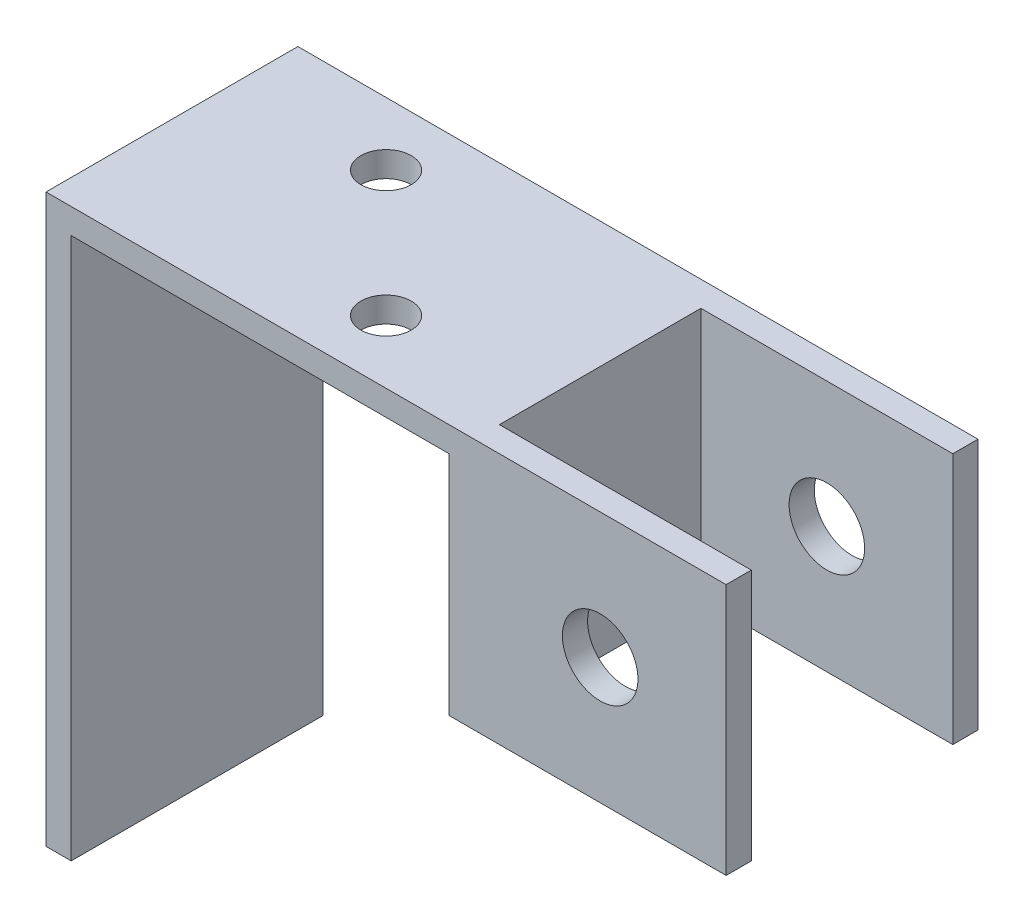
ISO-10303-21;
HEADER;
FILE_DESCRIPTION(('STEP AP214'),'2;1');
FILE_NAME('part.step','',(''),(''),'','','');
FILE_SCHEMA(('AUTOMOTIVE_DESIGN { 1 0 10303 214 1 1 1 1 }'));
ENDSEC;
DATA;
#1=APPLICATION_CONTEXT('core data for automotive mechanical design processes');
#2=APPLICATION_PROTOCOL_DEFINITION('international standard','automotive_design',2000,#1);
#3=PRODUCT_CONTEXT('',#1,'mechanical');
#4=PRODUCT('Part','Part','',(#3));
#5=PRODUCT_RELATED_PRODUCT_CATEGORY('part','',(#4));
#6=PRODUCT_DEFINITION_FORMATION('','',#4);
#7=PRODUCT_DEFINITION_CONTEXT('part definition',#1,'design');
#8=PRODUCT_DEFINITION('design','',#6,#7);
#9=PRODUCT_DEFINITION_SHAPE('','',#8);
#10=(LENGTH_UNIT() NAMED_UNIT(*) SI_UNIT(.MILLI.,.METRE.));
#11=(NAMED_UNIT(*) PLANE_ANGLE_UNIT() SI_UNIT($,.RADIAN.));
#12=(NAMED_UNIT(*) SI_UNIT($,.STERADIAN.) SOLID_ANGLE_UNIT());
#13=UNCERTAINTY_MEASURE_WITH_UNIT(LENGTH_MEASURE(1.E-05),#10,'distance_accuracy_value','');
#14=(GEOMETRIC_REPRESENTATION_CONTEXT(3) GLOBAL_UNCERTAINTY_ASSIGNED_CONTEXT((#13)) GLOBAL_UNIT_ASSIGNED_CONTEXT((#10,
#11,#12)) REPRESENTATION_CONTEXT('',''));
#15=CARTESIAN_POINT('',(0.,0.,0.));
#16=DIRECTION('',(0.,0.,1.));
#17=DIRECTION('',(1.,0.,0.));
#18=AXIS2_PLACEMENT_3D('',#15,#16,#17);
#19=CARTESIAN_POINT('',(25.7037037037037,-7.81481481481484,20.));
#20=DIRECTION('',(-1.,0.,0.));
#21=DIRECTION('',(0.,0.,1.));
#22=AXIS2_PLACEMENT_3D('',#19,#20,#21);
#23=PLANE('',#22);
#24=DIRECTION('',(0.,-1.,0.));
#25=VECTOR('',#24,1.);
#26=CARTESIAN_POINT('',(25.7037037037037,12.1851851851852,2.00000000000001));
#27=LINE('',#26,#25);
#28=CARTESIAN_POINT('',(25.7037037037037,12.1851851851852,2.00000000000001));
#29=VERTEX_POINT('',#28);
#30=CARTESIAN_POINT('',(25.7037037037037,-7.81481481481484,2.00000000000001));
#31=VERTEX_POINT('',#30);
#32=EDGE_CURVE('E51',#29,#31,#27,.T.);
#33=ORIENTED_EDGE('',*,*,#32,.F.);
#34=DIRECTION('',(0.,0.,-1.));
#35=VECTOR('',#34,1.);
#36=CARTESIAN_POINT('',(25.7037037037037,12.1851851851852,20.));
#37=LINE('',#36,#35);
#38=CARTESIAN_POINT('',(25.7037037037037,12.1851851851852,18.));
#39=VERTEX_POINT('',#38);
#40=EDGE_CURVE('E200',#39,#29,#37,.T.);
#41=ORIENTED_EDGE('',*,*,#40,.F.);
#42=DIRECTION('',(0.,1.,0.));
#43=VECTOR('',#42,1.);
#44=CARTESIAN_POINT('',(25.7037037037037,12.1851851851852,18.));
#45=LINE('',#44,#43);
#46=CARTESIAN_POINT('',(25.7037037037037,-7.81481481481484,18.));
#47=VERTEX_POINT('',#46);
#48=EDGE_CURVE('E159',#47,#39,#45,.T.);
#49=ORIENTED_EDGE('',*,*,#48,.F.);
#50=DIRECTION('',(0.,0.,-1.));
#51=VECTOR('',#50,1.);
#52=CARTESIAN_POINT('',(25.7037037037037,-7.81481481481484,20.));
#53=LINE('',#52,#51);
#54=EDGE_CURVE('E56',#47,#31,#53,.T.);
#55=ORIENTED_EDGE('',*,*,#54,.T.);
#56=EDGE_LOOP('',(#33,#41,#49,#55));
#57=FACE_BOUND('',#56,.T.);
#58=ADVANCED_FACE('F34',(#57),#23,.F.);
#59=CARTESIAN_POINT('',(25.7037037037037,12.1851851851852,20.));
#60=DIRECTION('',(0.,-1.,0.));
#61=DIRECTION('',(1.,0.,0.));
#62=AXIS2_PLACEMENT_3D('',#59,#60,#61);
#63=PLANE('',#62);
#64=CARTESIAN_POINT('',(13.7037037037037,12.1851851851852,15.));
#65=DIRECTION('',(0.,1.,0.));
#66=DIRECTION('',(-1.,0.,0.));
#67=AXIS2_PLACEMENT_3D('',#64,#65,#66);
#68=CIRCLE('',#67,2.);
#69=CARTESIAN_POINT('',(11.7037037037037,12.1851851851852,15.));
#70=VERTEX_POINT('',#69);
#71=EDGE_CURVE('E179',#70,#70,#68,.T.);
#72=ORIENTED_EDGE('',*,*,#71,.F.);
#73=EDGE_LOOP('',(#72));
#74=FACE_BOUND('',#73,.T.);
#75=CARTESIAN_POINT('',(3.70370370370367,12.1851851851852,5.));
#76=DIRECTION('',(0.,1.,0.));
#77=DIRECTION('',(-1.,0.,0.));
#78=AXIS2_PLACEMENT_3D('',#75,#76,#77);
#79=CIRCLE('',#78,2.);
#80=CARTESIAN_POINT('',(1.70370370370367,12.1851851851852,5.));
#81=VERTEX_POINT('',#80);
#82=EDGE_CURVE('E178',#81,#81,#79,.T.);
#83=ORIENTED_EDGE('',*,*,#82,.F.);
#84=EDGE_LOOP('',(#83));
#85=FACE_BOUND('',#84,.T.);
#86=DIRECTION('',(-1.,0.,0.));
#87=VECTOR('',#86,1.);
#88=CARTESIAN_POINT('',(25.7037037037037,12.1851851851852,0.));
#89=LINE('',#88,#87);
#90=CARTESIAN_POINT('',(45.7037037037037,12.1851851851852,0.));
#91=VERTEX_POINT('',#90);
#92=CARTESIAN_POINT('',(-8.29629629629633,12.1851851851852,0.));
#93=VERTEX_POINT('',#92);
#94=EDGE_CURVE('E123',#91,#93,#89,.T.);
#95=ORIENTED_EDGE('',*,*,#94,.T.);
#96=DIRECTION('',(0.,0.,-1.));
#97=VECTOR('',#96,1.);
#98=CARTESIAN_POINT('',(-8.29629629629633,12.1851851851852,20.));
#99=LINE('',#98,#97);
#100=CARTESIAN_POINT('',(-8.29629629629633,12.1851851851852,20.));
#101=VERTEX_POINT('',#100);
#102=EDGE_CURVE('E11',#101,#93,#99,.T.);
#103=ORIENTED_EDGE('',*,*,#102,.F.);
#104=DIRECTION('',(-1.,0.,0.));
#105=VECTOR('',#104,1.);
#106=CARTESIAN_POINT('',(25.7037037037037,12.1851851851852,20.));
#107=LINE('',#106,#105);
#108=CARTESIAN_POINT('',(45.7037037037037,12.1851851851852,20.));
#109=VERTEX_POINT('',#108);
#110=EDGE_CURVE('E185',#109,#101,#107,.T.);
#111=ORIENTED_EDGE('',*,*,#110,.F.);
#112=DIRECTION('',(0.,0.,1.));
#113=VECTOR('',#112,1.);
#114=CARTESIAN_POINT('',(45.7037037037037,12.1851851851852,20.));
#115=LINE('',#114,#113);
#116=CARTESIAN_POINT('',(45.7037037037037,12.1851851851852,18.));
#117=VERTEX_POINT('',#116);
#118=EDGE_CURVE('E167',#117,#109,#115,.T.);
#119=ORIENTED_EDGE('',*,*,#118,.F.);
#120=DIRECTION('',(-1.,0.,0.));
#121=VECTOR('',#120,1.);
#122=CARTESIAN_POINT('',(45.7037037037037,12.1851851851852,18.));
#123=LINE('',#122,#121);
#124=EDGE_CURVE('E170',#117,#39,#123,.T.);
#125=ORIENTED_EDGE('',*,*,#124,.T.);
#126=ORIENTED_EDGE('',*,*,#40,.T.);
#127=DIRECTION('',(-1.,0.,0.));
#128=VECTOR('',#127,1.);
#129=CARTESIAN_POINT('',(45.7037037037037,12.1851851851852,2.00000000000001));
#130=LINE('',#129,#128);
#131=CARTESIAN_POINT('',(45.7037037037037,12.1851851851852,2.00000000000001));
#132=VERTEX_POINT('',#131);
#133=EDGE_CURVE('E138',#132,#29,#130,.T.);
#134=ORIENTED_EDGE('',*,*,#133,.F.);
#135=DIRECTION('',(0.,0.,1.));
#136=VECTOR('',#135,1.);
#137=CARTESIAN_POINT('',(45.7037037037037,12.1851851851852,0.));
#138=LINE('',#137,#136);
#139=EDGE_CURVE('E136',#91,#132,#138,.T.);
#140=ORIENTED_EDGE('',*,*,#139,.F.);
#141=EDGE_LOOP('',(#95,#103,#111,#119,#125,#126,#134,#140));
#142=FACE_BOUND('',#141,.T.);
#143=ADVANCED_FACE('F36',(#74,#85,#142),#63,.F.);
#144=CARTESIAN_POINT('',(-8.29629629629633,12.1851851851852,20.));
#145=DIRECTION('',(1.,0.,0.));
#146=DIRECTION('',(0.,1.,0.));
#147=AXIS2_PLACEMENT_3D('',#144,#145,#146);
#148=PLANE('',#147);
#149=DIRECTION('',(0.,-1.,0.));
#150=VECTOR('',#149,1.);
#151=CARTESIAN_POINT('',(-8.29629629629633,12.1851851851852,0.));
#152=LINE('',#151,#150);
#153=CARTESIAN_POINT('',(-8.29629629629632,-32.8148148148148,0.));
#154=VERTEX_POINT('',#153);
#155=EDGE_CURVE('E130',#93,#154,#152,.T.);
#156=ORIENTED_EDGE('',*,*,#155,.T.);
#157=DIRECTION('',(0.,0.,-1.));
#158=VECTOR('',#157,1.);
#159=CARTESIAN_POINT('',(-8.29629629629632,-32.8148148148148,20.));
#160=LINE('',#159,#158);
#161=CARTESIAN_POINT('',(-8.29629629629632,-32.8148148148148,20.));
#162=VERTEX_POINT('',#161);
#163=EDGE_CURVE('E43',#162,#154,#160,.T.);
#164=ORIENTED_EDGE('',*,*,#163,.F.);
#165=DIRECTION('',(0.,-1.,0.));
#166=VECTOR('',#165,1.);
#167=CARTESIAN_POINT('',(-8.29629629629633,12.1851851851852,20.));
#168=LINE('',#167,#166);
#169=EDGE_CURVE('E188',#101,#162,#168,.T.);
#170=ORIENTED_EDGE('',*,*,#169,.F.);
#171=ORIENTED_EDGE('',*,*,#102,.T.);
#172=EDGE_LOOP('',(#156,#164,#170,#171));
#173=FACE_BOUND('',#172,.T.);
#174=ADVANCED_FACE('F255',(#173),#148,.F.);
#175=CARTESIAN_POINT('',(-8.29629629629632,-32.8148148148148,20.));
#176=DIRECTION('',(0.,1.,0.));
#177=DIRECTION('',(0.,0.,1.));
#178=AXIS2_PLACEMENT_3D('',#175,#176,#177);
#179=PLANE('',#178);
#180=DIRECTION('',(1.,0.,0.));
#181=VECTOR('',#180,1.);
#182=CARTESIAN_POINT('',(-8.29629629629632,-32.8148148148148,0.));
#183=LINE('',#182,#181);
#184=CARTESIAN_POINT('',(-6.29629629629632,-32.8148148148148,0.));
#185=VERTEX_POINT('',#184);
#186=EDGE_CURVE('E203',#154,#185,#183,.T.);
#187=ORIENTED_EDGE('',*,*,#186,.T.);
#188=DIRECTION('',(0.,0.,-1.));
#189=VECTOR('',#188,1.);
#190=CARTESIAN_POINT('',(-6.29629629629632,-32.8148148148148,20.));
#191=LINE('',#190,#189);
#192=CARTESIAN_POINT('',(-6.29629629629632,-32.8148148148148,20.));
#193=VERTEX_POINT('',#192);
#194=EDGE_CURVE('E223',#193,#185,#191,.T.);
#195=ORIENTED_EDGE('',*,*,#194,.F.);
#196=DIRECTION('',(1.,0.,0.));
#197=VECTOR('',#196,1.);
#198=CARTESIAN_POINT('',(-8.29629629629632,-32.8148148148148,20.));
#199=LINE('',#198,#197);
#200=EDGE_CURVE('E191',#162,#193,#199,.T.);
#201=ORIENTED_EDGE('',*,*,#200,.F.);
#202=ORIENTED_EDGE('',*,*,#163,.T.);
#203=EDGE_LOOP('',(#187,#195,#201,#202));
#204=FACE_BOUND('',#203,.T.);
#205=ADVANCED_FACE('F274',(#204),#179,.F.);
#206=CARTESIAN_POINT('',(-6.29629629629632,-32.8148148148148,20.));
#207=DIRECTION('',(-1.,0.,0.));
#208=DIRECTION('',(0.,-1.,0.));
#209=AXIS2_PLACEMENT_3D('',#206,#207,#208);
#210=PLANE('',#209);
#211=DIRECTION('',(0.,1.,0.));
#212=VECTOR('',#211,1.);
#213=CARTESIAN_POINT('',(-6.29629629629632,-32.8148148148148,0.));
#214=LINE('',#213,#212);
#215=CARTESIAN_POINT('',(-6.29629629629633,10.1851851851852,0.));
#216=VERTEX_POINT('',#215);
#217=EDGE_CURVE('E205',#185,#216,#214,.T.);
#218=ORIENTED_EDGE('',*,*,#217,.T.);
#219=DIRECTION('',(0.,0.,-1.));
#220=VECTOR('',#219,1.);
#221=CARTESIAN_POINT('',(-6.29629629629633,10.1851851851852,20.));
#222=LINE('',#221,#220);
#223=CARTESIAN_POINT('',(-6.29629629629633,10.1851851851852,20.));
#224=VERTEX_POINT('',#223);
#225=EDGE_CURVE('E220',#224,#216,#222,.T.);
#226=ORIENTED_EDGE('',*,*,#225,.F.);
#227=DIRECTION('',(0.,1.,0.));
#228=VECTOR('',#227,1.);
#229=CARTESIAN_POINT('',(-6.29629629629632,-32.8148148148148,20.));
#230=LINE('',#229,#228);
#231=EDGE_CURVE('E193',#193,#224,#230,.T.);
#232=ORIENTED_EDGE('',*,*,#231,.F.);
#233=ORIENTED_EDGE('',*,*,#194,.T.);
#234=EDGE_LOOP('',(#218,#226,#232,#233));
#235=FACE_BOUND('',#234,.T.);
#236=ADVANCED_FACE('F271',(#235),#210,.F.);
#237=CARTESIAN_POINT('',(-6.29629629629633,10.1851851851852,20.));
#238=DIRECTION('',(0.,1.,0.));
#239=DIRECTION('',(-1.,0.,0.));
#240=AXIS2_PLACEMENT_3D('',#237,#238,#239);
#241=PLANE('',#240);
#242=CARTESIAN_POINT('',(13.7037037037037,10.1851851851852,15.));
#243=DIRECTION('',(0.,1.,0.));
#244=DIRECTION('',(-1.,0.,0.));
#245=AXIS2_PLACEMENT_3D('',#242,#243,#244);
#246=CIRCLE('',#245,2.);
#247=CARTESIAN_POINT('',(11.7037037037037,10.1851851851852,15.));
#248=VERTEX_POINT('',#247);
#249=EDGE_CURVE('E133',#248,#248,#246,.T.);
#250=ORIENTED_EDGE('',*,*,#249,.T.);
#251=EDGE_LOOP('',(#250));
#252=FACE_BOUND('',#251,.T.);
#253=CARTESIAN_POINT('',(3.70370370370367,10.1851851851852,5.));
#254=DIRECTION('',(0.,1.,0.));
#255=DIRECTION('',(-1.,0.,0.));
#256=AXIS2_PLACEMENT_3D('',#253,#254,#255);
#257=CIRCLE('',#256,2.);
#258=CARTESIAN_POINT('',(1.70370370370367,10.1851851851852,5.));
#259=VERTEX_POINT('',#258);
#260=EDGE_CURVE('E182',#259,#259,#257,.T.);
#261=ORIENTED_EDGE('',*,*,#260,.T.);
#262=EDGE_LOOP('',(#261));
#263=FACE_BOUND('',#262,.T.);
#264=DIRECTION('',(1.,0.,0.));
#265=VECTOR('',#264,1.);
#266=CARTESIAN_POINT('',(-6.29629629629633,10.1851851851852,0.));
#267=LINE('',#266,#265);
#268=CARTESIAN_POINT('',(23.7037037037037,10.1851851851852,0.));
#269=VERTEX_POINT('',#268);
#270=EDGE_CURVE('E207',#216,#269,#267,.T.);
#271=ORIENTED_EDGE('',*,*,#270,.T.);
#272=DIRECTION('',(0.,0.,-1.));
#273=VECTOR('',#272,1.);
#274=CARTESIAN_POINT('',(23.7037037037037,10.1851851851852,20.));
#275=LINE('',#274,#273);
#276=CARTESIAN_POINT('',(23.7037037037037,10.1851851851852,20.));
#277=VERTEX_POINT('',#276);
#278=EDGE_CURVE('E217',#277,#269,#275,.T.);
#279=ORIENTED_EDGE('',*,*,#278,.F.);
#280=DIRECTION('',(1.,0.,0.));
#281=VECTOR('',#280,1.);
#282=CARTESIAN_POINT('',(-6.29629629629633,10.1851851851852,20.));
#283=LINE('',#282,#281);
#284=EDGE_CURVE('E195',#224,#277,#283,.T.);
#285=ORIENTED_EDGE('',*,*,#284,.F.);
#286=ORIENTED_EDGE('',*,*,#225,.T.);
#287=EDGE_LOOP('',(#271,#279,#285,#286));
#288=FACE_BOUND('',#287,.T.);
#289=ADVANCED_FACE('F232',(#252,#263,#288),#241,.F.);
#290=CARTESIAN_POINT('',(23.7037037037037,10.1851851851852,20.));
#291=DIRECTION('',(1.,0.,0.));
#292=DIRECTION('',(0.,1.,0.));
#293=AXIS2_PLACEMENT_3D('',#290,#291,#292);
#294=PLANE('',#293);
#295=DIRECTION('',(0.,-1.,0.));
#296=VECTOR('',#295,1.);
#297=CARTESIAN_POINT('',(23.7037037037037,10.1851851851852,0.));
#298=LINE('',#297,#296);
#299=CARTESIAN_POINT('',(23.7037037037037,-7.81481481481484,0.));
#300=VERTEX_POINT('',#299);
#301=EDGE_CURVE('E209',#269,#300,#298,.T.);
#302=ORIENTED_EDGE('',*,*,#301,.T.);
#303=DIRECTION('',(0.,0.,-1.));
#304=VECTOR('',#303,1.);
#305=CARTESIAN_POINT('',(23.7037037037037,-7.81481481481484,20.));
#306=LINE('',#305,#304);
#307=CARTESIAN_POINT('',(23.7037037037037,-7.81481481481484,20.));
#308=VERTEX_POINT('',#307);
#309=EDGE_CURVE('E214',#308,#300,#306,.T.);
#310=ORIENTED_EDGE('',*,*,#309,.F.);
#311=DIRECTION('',(0.,-1.,0.));
#312=VECTOR('',#311,1.);
#313=CARTESIAN_POINT('',(23.7037037037037,10.1851851851852,20.));
#314=LINE('',#313,#312);
#315=EDGE_CURVE('E197',#277,#308,#314,.T.);
#316=ORIENTED_EDGE('',*,*,#315,.F.);
#317=ORIENTED_EDGE('',*,*,#278,.T.);
#318=EDGE_LOOP('',(#302,#310,#316,#317));
#319=FACE_BOUND('',#318,.T.);
#320=ADVANCED_FACE('F264',(#319),#294,.F.);
#321=CARTESIAN_POINT('',(23.7037037037037,-7.81481481481484,20.));
#322=DIRECTION('',(0.,1.,0.));
#323=DIRECTION('',(-1.,0.,0.));
#324=AXIS2_PLACEMENT_3D('',#321,#322,#323);
#325=PLANE('',#324);
#326=DIRECTION('',(1.,0.,0.));
#327=VECTOR('',#326,1.);
#328=CARTESIAN_POINT('',(23.7037037037037,-7.81481481481484,0.));
#329=LINE('',#328,#327);
#330=CARTESIAN_POINT('',(45.7037037037037,-7.81481481481484,0.));
#331=VERTEX_POINT('',#330);
#332=EDGE_CURVE('E189',#300,#331,#329,.T.);
#333=ORIENTED_EDGE('',*,*,#332,.T.);
#334=DIRECTION('',(0.,0.,-1.));
#335=VECTOR('',#334,1.);
#336=CARTESIAN_POINT('',(45.7037037037037,-7.81481481481484,0.));
#337=LINE('',#336,#335);
#338=CARTESIAN_POINT('',(45.7037037037037,-7.81481481481484,2.00000000000001));
#339=VERTEX_POINT('',#338);
#340=EDGE_CURVE('E146',#339,#331,#337,.T.);
#341=ORIENTED_EDGE('',*,*,#340,.F.);
#342=DIRECTION('',(-1.,0.,0.));
#343=VECTOR('',#342,1.);
#344=CARTESIAN_POINT('',(45.7037037037037,-7.81481481481484,2.00000000000001));
#345=LINE('',#344,#343);
#346=EDGE_CURVE('E154',#339,#31,#345,.T.);
#347=ORIENTED_EDGE('',*,*,#346,.T.);
#348=ORIENTED_EDGE('',*,*,#54,.F.);
#349=DIRECTION('',(-1.,0.,0.));
#350=VECTOR('',#349,1.);
#351=CARTESIAN_POINT('',(45.7037037037037,-7.81481481481484,18.));
#352=LINE('',#351,#350);
#353=CARTESIAN_POINT('',(45.7037037037037,-7.81481481481484,18.));
#354=VERTEX_POINT('',#353);
#355=EDGE_CURVE('E175',#354,#47,#352,.T.);
#356=ORIENTED_EDGE('',*,*,#355,.F.);
#357=DIRECTION('',(0.,0.,-1.));
#358=VECTOR('',#357,1.);
#359=CARTESIAN_POINT('',(45.7037037037037,-7.81481481481484,20.));
#360=LINE('',#359,#358);
#361=CARTESIAN_POINT('',(45.7037037037037,-7.81481481481484,20.));
#362=VERTEX_POINT('',#361);
#363=EDGE_CURVE('E163',#362,#354,#360,.T.);
#364=ORIENTED_EDGE('',*,*,#363,.F.);
#365=DIRECTION('',(1.,0.,0.));
#366=VECTOR('',#365,1.);
#367=CARTESIAN_POINT('',(23.7037037037037,-7.81481481481484,20.));
#368=LINE('',#367,#366);
#369=EDGE_CURVE('E199',#308,#362,#368,.T.);
#370=ORIENTED_EDGE('',*,*,#369,.F.);
#371=ORIENTED_EDGE('',*,*,#309,.T.);
#372=EDGE_LOOP('',(#333,#341,#347,#348,#356,#364,#370,#371));
#373=FACE_BOUND('',#372,.T.);
#374=ADVANCED_FACE('F260',(#373),#325,.F.);
#375=CARTESIAN_POINT('',(0.,0.,20.));
#376=DIRECTION('',(0.,0.,1.));
#377=DIRECTION('',(1.,0.,0.));
#378=AXIS2_PLACEMENT_3D('',#375,#376,#377);
#379=PLANE('',#378);
#380=CARTESIAN_POINT('',(35.7037037037037,2.18518518518516,20.));
#381=DIRECTION('',(0.,0.,-1.));
#382=DIRECTION('',(-1.,0.,0.));
#383=AXIS2_PLACEMENT_3D('',#380,#381,#382);
#384=CIRCLE('',#383,3.);
#385=CARTESIAN_POINT('',(32.7037037037037,2.18518518518516,20.));
#386=VERTEX_POINT('',#385);
#387=EDGE_CURVE('E335',#386,#386,#384,.T.);
#388=ORIENTED_EDGE('',*,*,#387,.T.);
#389=EDGE_LOOP('',(#388));
#390=FACE_BOUND('',#389,.T.);
#391=ORIENTED_EDGE('',*,*,#110,.T.);
#392=ORIENTED_EDGE('',*,*,#169,.T.);
#393=ORIENTED_EDGE('',*,*,#200,.T.);
#394=ORIENTED_EDGE('',*,*,#231,.T.);
#395=ORIENTED_EDGE('',*,*,#284,.T.);
#396=ORIENTED_EDGE('',*,*,#315,.T.);
#397=ORIENTED_EDGE('',*,*,#369,.T.);
#398=DIRECTION('',(0.,-1.,0.));
#399=VECTOR('',#398,1.);
#400=CARTESIAN_POINT('',(45.7037037037037,12.1851851851852,20.));
#401=LINE('',#400,#399);
#402=EDGE_CURVE('E160',#109,#362,#401,.T.);
#403=ORIENTED_EDGE('',*,*,#402,.F.);
#404=EDGE_LOOP('',(#391,#392,#393,#394,#395,#396,#397,#403));
#405=FACE_BOUND('',#404,.T.);
#406=ADVANCED_FACE('F263',(#390,#405),#379,.T.);
#407=CARTESIAN_POINT('',(0.,0.,0.));
#408=DIRECTION('',(0.,0.,1.));
#409=DIRECTION('',(1.,0.,0.));
#410=AXIS2_PLACEMENT_3D('',#407,#408,#409);
#411=PLANE('',#410);
#412=CARTESIAN_POINT('',(35.7037037037037,2.18518518518516,0.));
#413=DIRECTION('',(0.,0.,1.));
#414=DIRECTION('',(1.,0.,0.));
#415=AXIS2_PLACEMENT_3D('',#412,#413,#414);
#416=CIRCLE('',#415,3.);
#417=CARTESIAN_POINT('',(38.7037037037037,2.18518518518516,0.));
#418=VERTEX_POINT('',#417);
#419=EDGE_CURVE('E148',#418,#418,#416,.T.);
#420=ORIENTED_EDGE('',*,*,#419,.T.);
#421=EDGE_LOOP('',(#420));
#422=FACE_BOUND('',#421,.T.);
#423=ORIENTED_EDGE('',*,*,#94,.F.);
#424=DIRECTION('',(0.,1.,0.));
#425=VECTOR('',#424,1.);
#426=CARTESIAN_POINT('',(45.7037037037037,12.1851851851852,0.));
#427=LINE('',#426,#425);
#428=EDGE_CURVE('E128',#331,#91,#427,.T.);
#429=ORIENTED_EDGE('',*,*,#428,.F.);
#430=ORIENTED_EDGE('',*,*,#332,.F.);
#431=ORIENTED_EDGE('',*,*,#301,.F.);
#432=ORIENTED_EDGE('',*,*,#270,.F.);
#433=ORIENTED_EDGE('',*,*,#217,.F.);
#434=ORIENTED_EDGE('',*,*,#186,.F.);
#435=ORIENTED_EDGE('',*,*,#155,.F.);
#436=EDGE_LOOP('',(#423,#429,#430,#431,#432,#433,#434,#435));
#437=FACE_BOUND('',#436,.T.);
#438=ADVANCED_FACE('F125',(#422,#437),#411,.F.);
#439=CARTESIAN_POINT('',(3.70370370370367,-7.81481481481484,5.));
#440=DIRECTION('',(0.,1.,0.));
#441=DIRECTION('',(-1.,0.,0.));
#442=AXIS2_PLACEMENT_3D('',#439,#440,#441);
#443=CYLINDRICAL_SURFACE('',#442,2.);
#444=ORIENTED_EDGE('',*,*,#82,.T.);
#445=EDGE_LOOP('',(#444));
#446=FACE_BOUND('',#445,.T.);
#447=ORIENTED_EDGE('',*,*,#260,.F.);
#448=EDGE_LOOP('',(#447));
#449=FACE_BOUND('',#448,.T.);
#450=ADVANCED_FACE('F238',(#446,#449),#443,.F.);
#451=CARTESIAN_POINT('',(13.7037037037037,-7.81481481481484,15.));
#452=DIRECTION('',(0.,1.,0.));
#453=DIRECTION('',(-1.,0.,0.));
#454=AXIS2_PLACEMENT_3D('',#451,#452,#453);
#455=CYLINDRICAL_SURFACE('',#454,2.);
#456=ORIENTED_EDGE('',*,*,#71,.T.);
#457=EDGE_LOOP('',(#456));
#458=FACE_BOUND('',#457,.T.);
#459=ORIENTED_EDGE('',*,*,#249,.F.);
#460=EDGE_LOOP('',(#459));
#461=FACE_BOUND('',#460,.T.);
#462=ADVANCED_FACE('F235',(#458,#461),#455,.F.);
#463=CARTESIAN_POINT('',(45.7037037037037,12.1851851851852,18.));
#464=DIRECTION('',(0.,0.,1.));
#465=DIRECTION('',(1.,0.,0.));
#466=AXIS2_PLACEMENT_3D('',#463,#464,#465);
#467=PLANE('',#466);
#468=CARTESIAN_POINT('',(35.7037037037037,2.18518518518516,18.));
#469=DIRECTION('',(0.,0.,1.));
#470=DIRECTION('',(1.,0.,0.));
#471=AXIS2_PLACEMENT_3D('',#468,#469,#470);
#472=CIRCLE('',#471,3.);
#473=CARTESIAN_POINT('',(38.7037037037037,2.18518518518516,18.));
#474=VERTEX_POINT('',#473);
#475=EDGE_CURVE('E332',#474,#474,#472,.T.);
#476=ORIENTED_EDGE('',*,*,#475,.T.);
#477=EDGE_LOOP('',(#476));
#478=FACE_BOUND('',#477,.T.);
#479=ORIENTED_EDGE('',*,*,#48,.T.);
#480=ORIENTED_EDGE('',*,*,#124,.F.);
#481=DIRECTION('',(0.,1.,0.));
#482=VECTOR('',#481,1.);
#483=CARTESIAN_POINT('',(45.7037037037037,12.1851851851852,18.));
#484=LINE('',#483,#482);
#485=EDGE_CURVE('E165',#354,#117,#484,.T.);
#486=ORIENTED_EDGE('',*,*,#485,.F.);
#487=ORIENTED_EDGE('',*,*,#355,.T.);
#488=EDGE_LOOP('',(#479,#480,#486,#487));
#489=FACE_BOUND('',#488,.T.);
#490=ADVANCED_FACE('F237',(#478,#489),#467,.F.);
#491=CARTESIAN_POINT('',(45.7037037037037,0.,0.));
#492=DIRECTION('',(1.,0.,0.));
#493=DIRECTION('',(0.,0.,-1.));
#494=AXIS2_PLACEMENT_3D('',#491,#492,#493);
#495=PLANE('',#494);
#496=ORIENTED_EDGE('',*,*,#402,.T.);
#497=ORIENTED_EDGE('',*,*,#363,.T.);
#498=ORIENTED_EDGE('',*,*,#485,.T.);
#499=ORIENTED_EDGE('',*,*,#118,.T.);
#500=EDGE_LOOP('',(#496,#497,#498,#499));
#501=FACE_BOUND('',#500,.T.);
#502=ADVANCED_FACE('F245',(#501),#495,.T.);
#503=CARTESIAN_POINT('',(45.7037037037037,12.1851851851852,2.00000000000001));
#504=DIRECTION('',(0.,0.,-1.));
#505=DIRECTION('',(-1.,0.,0.));
#506=AXIS2_PLACEMENT_3D('',#503,#504,#505);
#507=PLANE('',#506);
#508=CARTESIAN_POINT('',(35.7037037037037,2.18518518518516,2.00000000000001));
#509=DIRECTION('',(0.,0.,-1.));
#510=DIRECTION('',(-1.,0.,0.));
#511=AXIS2_PLACEMENT_3D('',#508,#509,#510);
#512=CIRCLE('',#511,3.);
#513=CARTESIAN_POINT('',(32.7037037037037,2.18518518518516,2.00000000000001));
#514=VERTEX_POINT('',#513);
#515=EDGE_CURVE('E38',#514,#514,#512,.T.);
#516=ORIENTED_EDGE('',*,*,#515,.T.);
#517=EDGE_LOOP('',(#516));
#518=FACE_BOUND('',#517,.T.);
#519=ORIENTED_EDGE('',*,*,#32,.T.);
#520=ORIENTED_EDGE('',*,*,#346,.F.);
#521=DIRECTION('',(0.,-1.,0.));
#522=VECTOR('',#521,1.);
#523=CARTESIAN_POINT('',(45.7037037037037,12.1851851851852,2.00000000000001));
#524=LINE('',#523,#522);
#525=EDGE_CURVE('E141',#132,#339,#524,.T.);
#526=ORIENTED_EDGE('',*,*,#525,.F.);
#527=ORIENTED_EDGE('',*,*,#133,.T.);
#528=EDGE_LOOP('',(#519,#520,#526,#527));
#529=FACE_BOUND('',#528,.T.);
#530=ADVANCED_FACE('F305',(#518,#529),#507,.F.);
#531=CARTESIAN_POINT('',(45.7037037037037,0.,0.));
#532=DIRECTION('',(-1.,0.,0.));
#533=DIRECTION('',(0.,0.,1.));
#534=AXIS2_PLACEMENT_3D('',#531,#532,#533);
#535=PLANE('',#534);
#536=ORIENTED_EDGE('',*,*,#428,.T.);
#537=ORIENTED_EDGE('',*,*,#139,.T.);
#538=ORIENTED_EDGE('',*,*,#525,.T.);
#539=ORIENTED_EDGE('',*,*,#340,.T.);
#540=EDGE_LOOP('',(#536,#537,#538,#539));
#541=FACE_BOUND('',#540,.T.);
#542=ADVANCED_FACE('F144',(#541),#535,.F.);
#543=CARTESIAN_POINT('',(35.7037037037037,2.18518518518516,20.));
#544=DIRECTION('',(0.,0.,-1.));
#545=DIRECTION('',(-1.,0.,0.));
#546=AXIS2_PLACEMENT_3D('',#543,#544,#545);
#547=CYLINDRICAL_SURFACE('',#546,3.);
#548=ORIENTED_EDGE('',*,*,#515,.F.);
#549=EDGE_LOOP('',(#548));
#550=FACE_BOUND('',#549,.T.);
#551=ORIENTED_EDGE('',*,*,#419,.F.);
#552=EDGE_LOOP('',(#551));
#553=FACE_BOUND('',#552,.T.);
#554=ADVANCED_FACE('F315',(#550,#553),#547,.F.);
#555=ORIENTED_EDGE('',*,*,#387,.F.);
#556=EDGE_LOOP('',(#555));
#557=FACE_BOUND('',#556,.T.);
#558=ORIENTED_EDGE('',*,*,#475,.F.);
#559=EDGE_LOOP('',(#558));
#560=FACE_BOUND('',#559,.T.);
#561=ADVANCED_FACE('F321',(#557,#560),#547,.F.);
#562=CLOSED_SHELL('',(#58,#143,#174,#205,#236,#289,#320,#374,#406,#438,#450,#462,#490,#502,#530,
#542,#554,#561));
#563=MANIFOLD_SOLID_BREP('B2',#562);
#564=ADVANCED_BREP_SHAPE_REPRESENTATION('',(#18,#563),#14);
#565=SHAPE_DEFINITION_REPRESENTATION(#9,#564);
ENDSEC;
END-ISO-10303-21;
